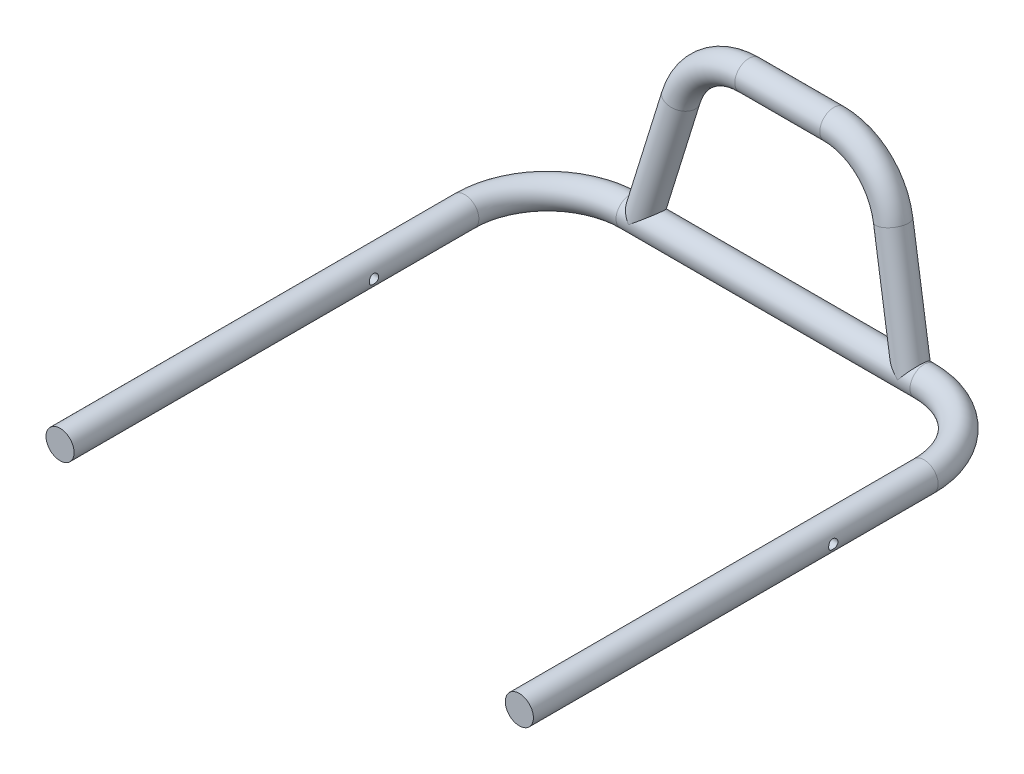
ISO-10303-21;
HEADER;
FILE_DESCRIPTION(('STEP AP214'),'2;1');
FILE_NAME('part.step','',(''),(''),'','','');
FILE_SCHEMA(('AUTOMOTIVE_DESIGN { 1 0 10303 214 1 1 1 1 }'));
ENDSEC;
DATA;
#1=APPLICATION_CONTEXT('core data for automotive mechanical design processes');
#2=APPLICATION_PROTOCOL_DEFINITION('international standard','automotive_design',2000,#1);
#3=PRODUCT_CONTEXT('',#1,'mechanical');
#4=PRODUCT('Part','Part','',(#3));
#5=PRODUCT_RELATED_PRODUCT_CATEGORY('part','',(#4));
#6=PRODUCT_DEFINITION_FORMATION('','',#4);
#7=PRODUCT_DEFINITION_CONTEXT('part definition',#1,'design');
#8=PRODUCT_DEFINITION('design','',#6,#7);
#9=PRODUCT_DEFINITION_SHAPE('','',#8);
#10=(LENGTH_UNIT() NAMED_UNIT(*) SI_UNIT(.MILLI.,.METRE.));
#11=(NAMED_UNIT(*) PLANE_ANGLE_UNIT() SI_UNIT($,.RADIAN.));
#12=(NAMED_UNIT(*) SI_UNIT($,.STERADIAN.) SOLID_ANGLE_UNIT());
#13=UNCERTAINTY_MEASURE_WITH_UNIT(LENGTH_MEASURE(1.E-05),#10,'distance_accuracy_value','');
#14=(GEOMETRIC_REPRESENTATION_CONTEXT(3) GLOBAL_UNCERTAINTY_ASSIGNED_CONTEXT((#13)) GLOBAL_UNIT_ASSIGNED_CONTEXT((#10,
#11,#12)) REPRESENTATION_CONTEXT('',''));
#15=CARTESIAN_POINT('',(0.,0.,0.));
#16=DIRECTION('',(0.,0.,1.));
#17=DIRECTION('',(1.,0.,0.));
#18=AXIS2_PLACEMENT_3D('',#15,#16,#17);
#19=CARTESIAN_POINT('',(155.575,0.,-274.2));
#20=DIRECTION('',(0.,0.,1.));
#21=DIRECTION('',(1.,0.,0.));
#22=AXIS2_PLACEMENT_3D('',#19,#20,#21);
#23=CYLINDRICAL_SURFACE('',#22,9.52500000000001);
#24=CARTESIAN_POINT('',(155.575,0.,0.));
#25=DIRECTION('',(0.,0.,1.));
#26=DIRECTION('',(1.,0.,0.));
#27=AXIS2_PLACEMENT_3D('',#24,#25,#26);
#28=CIRCLE('',#27,9.52500000000001);
#29=CARTESIAN_POINT('',(165.1,0.,0.));
#30=VERTEX_POINT('',#29);
#31=EDGE_CURVE('E121',#30,#30,#28,.F.);
#32=ORIENTED_EDGE('',*,*,#31,.T.);
#33=EDGE_LOOP('',(#32));
#34=FACE_BOUND('',#33,.T.);
#35=CARTESIAN_POINT('',(155.575,0.,-274.200000000001));
#36=DIRECTION('',(0.,0.,1.));
#37=DIRECTION('',(1.,0.,0.));
#38=AXIS2_PLACEMENT_3D('',#35,#36,#37);
#39=CIRCLE('',#38,9.52500000000001);
#40=CARTESIAN_POINT('',(165.1,0.,-274.200000000001));
#41=VERTEX_POINT('',#40);
#42=EDGE_CURVE('E125',#41,#41,#39,.F.);
#43=ORIENTED_EDGE('',*,*,#42,.F.);
#44=EDGE_LOOP('',(#43));
#45=FACE_BOUND('',#44,.T.);
#46=CARTESIAN_POINT('',(165.1,0.,-200.025));
#47=CARTESIAN_POINT('',(165.100000485805,-0.173238677165347,-200.024999194402));
#48=CARTESIAN_POINT('',(165.095230181865,-0.346472492659897,-200.039224844954));
#49=CARTESIAN_POINT('',(165.076670423954,-0.687837590771688,-200.095577420495));
#50=CARTESIAN_POINT('',(165.062880033668,-0.855968341777248,-200.137707242038));
#51=CARTESIAN_POINT('',(165.02777852603,-1.18215660666814,-200.248263597744));
#52=CARTESIAN_POINT('',(165.006479985455,-1.34023044718815,-200.316646173308));
#53=CARTESIAN_POINT('',(164.958536151526,-1.6426654243569,-200.477568223762));
#54=CARTESIAN_POINT('',(164.931889803702,-1.78702384834389,-200.570112463883));
#55=CARTESIAN_POINT('',(164.875022498565,-2.0629298181957,-200.780096930427));
#56=CARTESIAN_POINT('',(164.844715917725,-2.19393674844713,-200.898224168777));
#57=CARTESIAN_POINT('',(164.784414994364,-2.43469379932912,-201.154560716193));
#58=CARTESIAN_POINT('',(164.754420721975,-2.54443923892905,-201.292774435898));
#59=CARTESIAN_POINT('',(164.697198306153,-2.74264419157346,-201.590227740749));
#60=CARTESIAN_POINT('',(164.670074497003,-2.83040092485178,-201.749957623649));
#61=CARTESIAN_POINT('',(164.622965947041,-2.97757492456177,-202.082959099906));
#62=CARTESIAN_POINT('',(164.602979028104,-3.03700083920298,-202.256226541992));
#63=CARTESIAN_POINT('',(164.573308878803,-3.12379824029159,-202.605237478252));
#64=CARTESIAN_POINT('',(164.563301040685,-3.15218269826287,-202.780700636953));
#65=CARTESIAN_POINT('',(164.553762097987,-3.17925806658696,-203.134162419445));
#66=CARTESIAN_POINT('',(164.554227755972,-3.17795815259498,-203.312160242752));
#67=CARTESIAN_POINT('',(164.56529872651,-3.14648819425835,-203.65699880166));
#68=CARTESIAN_POINT('',(164.575439703794,-3.1176401743052,-203.823977679268));
#69=CARTESIAN_POINT('',(164.603958882755,-3.03404956704689,-204.150574107252));
#70=CARTESIAN_POINT('',(164.622338070645,-2.97930387942919,-204.310190773756));
#71=CARTESIAN_POINT('',(164.665593678417,-2.84460650934117,-204.620535479953));
#72=CARTESIAN_POINT('',(164.690569963931,-2.76426310464555,-204.771078980866));
#73=CARTESIAN_POINT('',(164.744163734779,-2.58092291251246,-205.056965133788));
#74=CARTESIAN_POINT('',(164.772782270847,-2.47791958175571,-205.192303378013));
#75=CARTESIAN_POINT('',(164.832262701076,-2.2458341312661,-205.45136582416));
#76=CARTESIAN_POINT('',(164.863163712016,-2.11567125149228,-205.574114805066));
#77=CARTESIAN_POINT('',(164.922420293788,-1.83622813465494,-205.796296771656));
#78=CARTESIAN_POINT('',(164.950775620334,-1.68694606622307,-205.895727521172));
#79=CARTESIAN_POINT('',(165.002118177025,-1.37143367142189,-206.069235753246));
#80=CARTESIAN_POINT('',(165.025049362755,-1.20504990262186,-206.143051935007));
#81=CARTESIAN_POINT('',(165.062553006836,-0.861279339682303,-206.261345077309));
#82=CARTESIAN_POINT('',(165.077128368542,-0.683896391141972,-206.305832229469));
#83=CARTESIAN_POINT('',(165.095797159518,-0.331418658755537,-206.362476739621));
#84=CARTESIAN_POINT('',(165.100317558221,-0.156557979570883,-206.375951894123));
#85=CARTESIAN_POINT('',(165.099647660561,0.192960847123759,-206.373943761325));
#86=CARTESIAN_POINT('',(165.094459003315,0.367619023839895,-206.358465362064));
#87=CARTESIAN_POINT('',(165.075235784768,0.706500575516016,-206.300032192938));
#88=CARTESIAN_POINT('',(165.06146180908,0.870879661700632,-206.257886295793));
#89=CARTESIAN_POINT('',(165.026716136855,1.19016766849015,-206.148325813818));
#90=CARTESIAN_POINT('',(165.005743522482,1.34507537851483,-206.08090800669));
#91=CARTESIAN_POINT('',(164.958043568371,1.64556534104865,-205.920751378905));
#92=CARTESIAN_POINT('',(164.931179368496,1.79079512051445,-205.827393166326));
#93=CARTESIAN_POINT('',(164.874741811841,2.0639558356805,-205.618733573707));
#94=CARTESIAN_POINT('',(164.845167629104,2.19188146775096,-205.503425492099));
#95=CARTESIAN_POINT('',(164.784939923379,2.43285171228499,-205.247942465554));
#96=CARTESIAN_POINT('',(164.754298414526,2.54495607735532,-205.106875704507));
#97=CARTESIAN_POINT('',(164.696774152107,2.74401763337735,-204.8072752722));
#98=CARTESIAN_POINT('',(164.669891429879,2.83097461468097,-204.648741455337));
#99=CARTESIAN_POINT('',(164.623190939376,2.97687025407195,-204.318638176455));
#100=CARTESIAN_POINT('',(164.603358905177,3.03586556962394,-204.147095898639));
#101=CARTESIAN_POINT('',(164.57329392573,3.12386556696095,-203.79569778611));
#102=CARTESIAN_POINT('',(164.563056656301,3.15288375947876,-203.615845734841));
#103=CARTESIAN_POINT('',(164.553832019255,3.17905219686556,-203.26287422007));
#104=CARTESIAN_POINT('',(164.554293708173,3.17776306695417,-203.089883569589));
#105=CARTESIAN_POINT('',(164.565052816908,3.1471942816996,-202.746720887122));
#106=CARTESIAN_POINT('',(164.575349651327,3.117916292281,-202.576548687993));
#107=CARTESIAN_POINT('',(164.60420864668,3.03330550668567,-202.247069269967));
#108=CARTESIAN_POINT('',(164.622610112214,2.97847812359926,-202.087617080611));
#109=CARTESIAN_POINT('',(164.665545662486,2.8447344862872,-201.780052982971));
#110=CARTESIAN_POINT('',(164.690081108238,2.76581288515833,-201.631943600978));
#111=CARTESIAN_POINT('',(164.743854827927,2.58210269895238,-201.344264347995));
#112=CARTESIAN_POINT('',(164.773251594638,2.47633567077753,-201.205349106473));
#113=CARTESIAN_POINT('',(164.832771561993,2.24359115395568,-200.946734842505));
#114=CARTESIAN_POINT('',(164.862894965968,2.11660766813346,-200.82704127219));
#115=CARTESIAN_POINT('',(164.921883469186,1.83909194322319,-200.605566490982));
#116=CARTESIAN_POINT('',(164.95065377219,1.68783480536164,-200.504665195891));
#117=CARTESIAN_POINT('',(165.00240021973,1.36955960976602,-200.329830388399));
#118=CARTESIAN_POINT('',(165.025377845077,1.20254559507019,-200.255889981697));
#119=CARTESIAN_POINT('',(165.062075103426,0.865167329863075,-200.140183816848));
#120=CARTESIAN_POINT('',(165.076162494415,0.695286130622578,-200.097128169614));
#121=CARTESIAN_POINT('',(165.095123424289,0.350267320832523,-200.03954060885));
#122=CARTESIAN_POINT('',(165.099999508888,0.175131176180764,-200.025000814398));
#123=CARTESIAN_POINT('',(165.1,0.,-200.025));
#124=B_SPLINE_CURVE_WITH_KNOTS('',3,(#46,#47,#48,#49,#50,#51,#52,#53,#54,#55,#56,#57,#58,#59,
#60,#61,#62,#63,#64,#65,#66,#67,#68,#69,#70,#71,#72,#73,#74,#75,#76,#77,#78,#79,#80,#81,#82,#83,
#84,#85,#86,#87,#88,#89,#90,#91,#92,#93,#94,#95,#96,#97,#98,#99,#100,#101,#102,#103,#104,#105,
#106,#107,#108,#109,#110,#111,#112,#113,#114,#115,#116,#117,#118,#119,#120,#121,#122,#123),
.UNSPECIFIED.,.T.,.F.,(4,2,2,2,2,2,2,2,2,2,2,2,2,2,2,2,2,2,2,2,2,2,2,2,2,2,2,2,2,2,2,2,2,2,2,2,
2,2,4),(0.,0.519071561632589,1.03819701322438,1.55645698636311,2.07481924951213,
2.60936372597751,3.1440257568791,3.69406121814519,4.24392866899745,4.77526114230344,
5.30642937910265,5.81332424300315,6.32027980466156,6.83539943417539,7.35066800622307,
7.89283745951091,8.43505888444013,8.98265937939886,9.53006948685135,10.0537512658116,
10.5773446429626,11.0857715158083,11.5942632377703,12.1161301950386,12.638156741095,
13.1839024764639,13.7296527614611,14.274292439,14.8186865394104,15.3351123975402,
15.8515075194062,16.3580948898032,16.8647947620873,17.3936046174648,17.92256420318,
18.4721392315144,19.0215736265905,19.5464607283686,20.0712027467109),.UNSPECIFIED.);
#125=CARTESIAN_POINT('',(165.1,0.,-200.025));
#126=VERTEX_POINT('',#125);
#127=EDGE_CURVE('E12',#126,#126,#124,.T.);
#128=ORIENTED_EDGE('',*,*,#127,.F.);
#129=EDGE_LOOP('',(#128));
#130=FACE_BOUND('',#129,.T.);
#131=CARTESIAN_POINT('',(146.05,0.,-200.025));
#132=CARTESIAN_POINT('',(146.049999514195,0.173238677165345,-200.024999194402));
#133=CARTESIAN_POINT('',(146.054769818135,0.346472492659893,-200.039224844954));
#134=CARTESIAN_POINT('',(146.073329576046,0.687837590771684,-200.095577420495));
#135=CARTESIAN_POINT('',(146.087119966332,0.855968341777245,-200.137707242038));
#136=CARTESIAN_POINT('',(146.12222147397,1.18215660666814,-200.248263597744));
#137=CARTESIAN_POINT('',(146.143520014545,1.34023044718816,-200.316646173308));
#138=CARTESIAN_POINT('',(146.191463848474,1.64266542435691,-200.477568223762));
#139=CARTESIAN_POINT('',(146.218110196298,1.78702384834389,-200.570112463883));
#140=CARTESIAN_POINT('',(146.274977501435,2.0629298181957,-200.780096930427));
#141=CARTESIAN_POINT('',(146.305284082275,2.19393674844713,-200.898224168777));
#142=CARTESIAN_POINT('',(146.365585005636,2.43469379932912,-201.154560716193));
#143=CARTESIAN_POINT('',(146.395579278025,2.54443923892905,-201.292774435898));
#144=CARTESIAN_POINT('',(146.452801693847,2.74264419157346,-201.590227740749));
#145=CARTESIAN_POINT('',(146.479925502997,2.83040092485178,-201.749957623649));
#146=CARTESIAN_POINT('',(146.527034052959,2.97757492456177,-202.082959099906));
#147=CARTESIAN_POINT('',(146.547020971896,3.03700083920298,-202.256226541992));
#148=CARTESIAN_POINT('',(146.576691121197,3.12379824029159,-202.605237478252));
#149=CARTESIAN_POINT('',(146.586698959315,3.15218269826287,-202.780700636953));
#150=CARTESIAN_POINT('',(146.596237902013,3.17925806658696,-203.134162419445));
#151=CARTESIAN_POINT('',(146.595772244028,3.17795815259498,-203.312160242752));
#152=CARTESIAN_POINT('',(146.58470127349,3.14648819425835,-203.65699880166));
#153=CARTESIAN_POINT('',(146.574560296206,3.1176401743052,-203.823977679268));
#154=CARTESIAN_POINT('',(146.546041117245,3.03404956704689,-204.150574107252));
#155=CARTESIAN_POINT('',(146.527661929355,2.97930387942919,-204.310190773756));
#156=CARTESIAN_POINT('',(146.484406321583,2.84460650934117,-204.620535479953));
#157=CARTESIAN_POINT('',(146.459430036069,2.76426310464556,-204.771078980866));
#158=CARTESIAN_POINT('',(146.405836265221,2.58092291251246,-205.056965133788));
#159=CARTESIAN_POINT('',(146.377217729153,2.47791958175572,-205.192303378013));
#160=CARTESIAN_POINT('',(146.317737298924,2.2458341312661,-205.45136582416));
#161=CARTESIAN_POINT('',(146.286836287984,2.11567125149229,-205.574114805066));
#162=CARTESIAN_POINT('',(146.227579706212,1.83622813465495,-205.796296771656));
#163=CARTESIAN_POINT('',(146.199224379666,1.68694606622308,-205.895727521172));
#164=CARTESIAN_POINT('',(146.147881822975,1.37143367142189,-206.069235753246));
#165=CARTESIAN_POINT('',(146.124950637245,1.20504990262186,-206.143051935007));
#166=CARTESIAN_POINT('',(146.087446993164,0.861279339682307,-206.261345077309));
#167=CARTESIAN_POINT('',(146.072871631458,0.683896391141974,-206.305832229469));
#168=CARTESIAN_POINT('',(146.054202840482,0.331418658755537,-206.362476739621));
#169=CARTESIAN_POINT('',(146.049682441779,0.156557979570882,-206.375951894123));
#170=CARTESIAN_POINT('',(146.050352339439,-0.192960847123759,-206.373943761325));
#171=CARTESIAN_POINT('',(146.055540996685,-0.367619023839895,-206.358465362064));
#172=CARTESIAN_POINT('',(146.074764215232,-0.706500575516016,-206.300032192938));
#173=CARTESIAN_POINT('',(146.08853819092,-0.870879661700632,-206.257886295793));
#174=CARTESIAN_POINT('',(146.123283863145,-1.19016766849015,-206.148325813818));
#175=CARTESIAN_POINT('',(146.144256477518,-1.34507537851483,-206.08090800669));
#176=CARTESIAN_POINT('',(146.191956431629,-1.64556534104865,-205.920751378905));
#177=CARTESIAN_POINT('',(146.218820631504,-1.79079512051445,-205.827393166326));
#178=CARTESIAN_POINT('',(146.275258188159,-2.0639558356805,-205.618733573707));
#179=CARTESIAN_POINT('',(146.304832370896,-2.19188146775096,-205.503425492099));
#180=CARTESIAN_POINT('',(146.365060076621,-2.43285171228499,-205.247942465554));
#181=CARTESIAN_POINT('',(146.395701585474,-2.54495607735531,-205.106875704507));
#182=CARTESIAN_POINT('',(146.453225847893,-2.74401763337734,-204.8072752722));
#183=CARTESIAN_POINT('',(146.480108570121,-2.83097461468097,-204.648741455337));
#184=CARTESIAN_POINT('',(146.526809060624,-2.97687025407195,-204.318638176455));
#185=CARTESIAN_POINT('',(146.546641094823,-3.03586556962394,-204.147095898639));
#186=CARTESIAN_POINT('',(146.57670607427,-3.12386556696095,-203.79569778611));
#187=CARTESIAN_POINT('',(146.586943343699,-3.15288375947876,-203.615845734841));
#188=CARTESIAN_POINT('',(146.596167980745,-3.17905219686556,-203.26287422007));
#189=CARTESIAN_POINT('',(146.595706291827,-3.17776306695417,-203.089883569589));
#190=CARTESIAN_POINT('',(146.584947183092,-3.1471942816996,-202.746720887122));
#191=CARTESIAN_POINT('',(146.574650348673,-3.11791629228101,-202.576548687993));
#192=CARTESIAN_POINT('',(146.54579135332,-3.03330550668567,-202.247069269967));
#193=CARTESIAN_POINT('',(146.527389887786,-2.97847812359926,-202.087617080611));
#194=CARTESIAN_POINT('',(146.484454337514,-2.8447344862872,-201.780052982971));
#195=CARTESIAN_POINT('',(146.459918891762,-2.76581288515833,-201.631943600978));
#196=CARTESIAN_POINT('',(146.406145172073,-2.58210269895238,-201.344264347995));
#197=CARTESIAN_POINT('',(146.376748405362,-2.47633567077753,-201.205349106473));
#198=CARTESIAN_POINT('',(146.317228438007,-2.24359115395568,-200.946734842505));
#199=CARTESIAN_POINT('',(146.287105034032,-2.11660766813346,-200.82704127219));
#200=CARTESIAN_POINT('',(146.228116530814,-1.8390919432232,-200.605566490982));
#201=CARTESIAN_POINT('',(146.19934622781,-1.68783480536164,-200.504665195891));
#202=CARTESIAN_POINT('',(146.14759978027,-1.36955960976603,-200.329830388399));
#203=CARTESIAN_POINT('',(146.124622154923,-1.20254559507019,-200.255889981697));
#204=CARTESIAN_POINT('',(146.087924896574,-0.865167329863077,-200.140183816848));
#205=CARTESIAN_POINT('',(146.073837505585,-0.695286130622579,-200.097128169614));
#206=CARTESIAN_POINT('',(146.054876575711,-0.350267320832524,-200.03954060885));
#207=CARTESIAN_POINT('',(146.050000491112,-0.175131176180764,-200.025000814398));
#208=CARTESIAN_POINT('',(146.05,0.,-200.025));
#209=B_SPLINE_CURVE_WITH_KNOTS('',3,(#131,#132,#133,#134,#135,#136,#137,#138,#139,#140,#141,
#142,#143,#144,#145,#146,#147,#148,#149,#150,#151,#152,#153,#154,#155,#156,#157,#158,#159,#160,
#161,#162,#163,#164,#165,#166,#167,#168,#169,#170,#171,#172,#173,#174,#175,#176,#177,#178,#179,
#180,#181,#182,#183,#184,#185,#186,#187,#188,#189,#190,#191,#192,#193,#194,#195,#196,#197,#198,
#199,#200,#201,#202,#203,#204,#205,#206,#207,#208),.UNSPECIFIED.,.T.,.F.,(4,2,2,2,2,2,2,2,2,2,2,
2,2,2,2,2,2,2,2,2,2,2,2,2,2,2,2,2,2,2,2,2,2,2,2,2,2,2,4),(0.,0.519071561632584,1.03819701322438,
1.55645698636312,2.07481924951214,2.60936372597751,3.1440257568791,3.69406121814519,
4.24392866899746,4.77526114230344,5.30642937910265,5.81332424300315,6.32027980466156,
6.83539943417539,7.35066800622307,7.8928374595109,8.43505888444013,8.98265937939885,
9.53006948685136,10.0537512658116,10.5773446429626,11.0857715158083,11.5942632377703,
12.1161301950386,12.638156741095,13.1839024764639,13.7296527614612,14.274292439,
14.8186865394104,15.3351123975402,15.8515075194062,16.3580948898033,16.8647947620873,
17.3936046174648,17.92256420318,18.4721392315144,19.0215736265905,19.5464607283686,
20.0712027467109),.UNSPECIFIED.);
#210=CARTESIAN_POINT('',(146.05,0.,-200.025));
#211=VERTEX_POINT('',#210);
#212=EDGE_CURVE('E85',#211,#211,#209,.T.);
#213=ORIENTED_EDGE('',*,*,#212,.F.);
#214=EDGE_LOOP('',(#213));
#215=FACE_BOUND('',#214,.T.);
#216=ADVANCED_FACE('F81',(#34,#45,#130,#215),#23,.T.);
#217=CARTESIAN_POINT('',(71.9014989347422,76.9144291486642,-336.929140612076));
#218=DIRECTION('',(0.241921895599665,-0.966603458097228,0.0845668447084632));
#219=DIRECTION('',(0.970078465084904,0.242791621722242,0.));
#220=AXIS2_PLACEMENT_3D('',#217,#218,#219);
#221=CYLINDRICAL_SURFACE('',#220,9.525);
#222=CARTESIAN_POINT('',(71.9014989347421,76.9144291486646,-336.929140612076));
#223=DIRECTION('',(0.241921895599664,-0.966603458097228,0.0845668447084661));
#224=DIRECTION('',(0.970078465084904,0.242791621722241,0.));
#225=AXIS2_PLACEMENT_3D('',#222,#223,#224);
#226=CIRCLE('',#225,9.525);
#227=CARTESIAN_POINT('',(81.143565727521,79.2099666240209,-337.129974117869));
#228=VERTEX_POINT('',#227);
#229=EDGE_CURVE('E128',#228,#228,#226,.F.);
#230=ORIENTED_EDGE('',*,*,#229,.F.);
#231=EDGE_LOOP('',(#230));
#232=FACE_BOUND('',#231,.T.);
#233=CARTESIAN_POINT('',(91.1516726670395,0.,-330.2));
#234=DIRECTION('',(0.788010753606721,-0.613318697538764,0.053658433163127));
#235=DIRECTION('',(-0.615661475325659,-0.785012134782296,0.0686796625237358));
#236=AXIS2_PLACEMENT_3D('',#233,#234,#235);
#237=ELLIPSE('',#236,12.0873984985663,9.525);
#238=CARTESIAN_POINT('',(91.1516726670395,-0.830158449671454,-339.688754499324));
#239=VERTEX_POINT('',#238);
#240=CARTESIAN_POINT('',(91.1516726670395,0.83015844967146,-320.711245500676));
#241=VERTEX_POINT('',#240);
#242=EDGE_CURVE('E95',#239,#241,#237,.T.);
#243=ORIENTED_EDGE('',*,*,#242,.F.);
#244=CARTESIAN_POINT('',(91.1516726670395,0.,-330.2));
#245=DIRECTION('',(-0.615661475325659,-0.785012134782296,0.0686796625237358));
#246=DIRECTION('',(0.788010753606721,-0.613318697538764,0.053658433163127));
#247=AXIS2_PLACEMENT_3D('',#244,#245,#246);
#248=ELLIPSE('',#247,15.4711645632231,9.525);
#249=EDGE_CURVE('E101',#241,#239,#248,.T.);
#250=ORIENTED_EDGE('',*,*,#249,.F.);
#251=EDGE_LOOP('',(#243,#250));
#252=FACE_BOUND('',#251,.T.);
#253=ADVANCED_FACE('F179',(#232,#252),#221,.T.);
#254=CARTESIAN_POINT('',(-71.9014989347422,76.9144291486642,-336.929140612076));
#255=DIRECTION('',(-0.241921895599665,-0.966603458097228,0.0845668447084632));
#256=DIRECTION('',(0.970078465084904,-0.242791621722242,0.));
#257=AXIS2_PLACEMENT_3D('',#254,#255,#256);
#258=CYLINDRICAL_SURFACE('',#257,9.525);
#259=CARTESIAN_POINT('',(-71.9014989347421,76.9144291486646,-336.929140612076));
#260=DIRECTION('',(0.241921895599664,0.966603458097228,-0.0845668447084661));
#261=DIRECTION('',(-0.970078465084904,0.242791621722241,0.));
#262=AXIS2_PLACEMENT_3D('',#259,#260,#261);
#263=CIRCLE('',#262,9.525);
#264=CARTESIAN_POINT('',(-81.143565727521,79.2099666240209,-337.129974117869));
#265=VERTEX_POINT('',#264);
#266=EDGE_CURVE('E149',#265,#265,#263,.T.);
#267=ORIENTED_EDGE('',*,*,#266,.F.);
#268=EDGE_LOOP('',(#267));
#269=FACE_BOUND('',#268,.T.);
#270=CARTESIAN_POINT('',(-91.1516726670395,0.,-330.2));
#271=DIRECTION('',(-0.788010753606721,-0.613318697538764,0.053658433163127));
#272=DIRECTION('',(0.615661475325659,-0.785012134782296,0.0686796625237358));
#273=AXIS2_PLACEMENT_3D('',#270,#271,#272);
#274=ELLIPSE('',#273,12.0873984985663,9.525);
#275=CARTESIAN_POINT('',(-91.1516726670395,0.83015844967144,-320.711245500676));
#276=VERTEX_POINT('',#275);
#277=CARTESIAN_POINT('',(-91.1516726670395,-0.830158449671475,-339.688754499324));
#278=VERTEX_POINT('',#277);
#279=EDGE_CURVE('E153',#276,#278,#274,.T.);
#280=ORIENTED_EDGE('',*,*,#279,.F.);
#281=CARTESIAN_POINT('',(-91.1516726670395,0.,-330.2));
#282=DIRECTION('',(0.615661475325659,-0.785012134782296,0.0686796625237358));
#283=DIRECTION('',(-0.788010753606721,-0.613318697538764,0.053658433163127));
#284=AXIS2_PLACEMENT_3D('',#281,#282,#283);
#285=ELLIPSE('',#284,15.4711645632231,9.525);
#286=EDGE_CURVE('E108',#278,#276,#285,.T.);
#287=ORIENTED_EDGE('',*,*,#286,.F.);
#288=EDGE_LOOP('',(#280,#287));
#289=FACE_BOUND('',#288,.T.);
#290=ADVANCED_FACE('F83',(#269,#289),#258,.T.);
#291=CARTESIAN_POINT('',(0.,110.482775260513,-339.865990350177));
#292=DIRECTION('',(-1.,0.,0.));
#293=DIRECTION('',(0.,0.,1.));
#294=AXIS2_PLACEMENT_3D('',#291,#292,#293);
#295=CYLINDRICAL_SURFACE('',#294,9.525);
#296=CARTESIAN_POINT('',(-28.7718539017738,110.482775260513,-339.865990350177));
#297=DIRECTION('',(1.,0.,0.));
#298=DIRECTION('',(0.,0.997815912943034,-0.0660560661685154));
#299=AXIS2_PLACEMENT_3D('',#296,#297,#298);
#300=CIRCLE('',#299,9.525);
#301=CARTESIAN_POINT('',(-28.7718539017738,119.971529759837,-340.696148799849));
#302=VERTEX_POINT('',#301);
#303=EDGE_CURVE('E146',#302,#302,#300,.T.);
#304=ORIENTED_EDGE('',*,*,#303,.T.);
#305=EDGE_LOOP('',(#304));
#306=FACE_BOUND('',#305,.T.);
#307=CARTESIAN_POINT('',(28.7718539017738,110.482775260513,-339.865990350177));
#308=DIRECTION('',(1.,0.,0.));
#309=DIRECTION('',(0.,0.997815912943034,-0.0660560661685154));
#310=AXIS2_PLACEMENT_3D('',#307,#308,#309);
#311=CIRCLE('',#310,9.525);
#312=CARTESIAN_POINT('',(28.7718539017738,119.971529759837,-340.696148799849));
#313=VERTEX_POINT('',#312);
#314=EDGE_CURVE('E124',#313,#313,#311,.F.);
#315=ORIENTED_EDGE('',*,*,#314,.T.);
#316=EDGE_LOOP('',(#315));
#317=FACE_BOUND('',#316,.T.);
#318=ADVANCED_FACE('F186',(#306,#317),#295,.T.);
#319=CARTESIAN_POINT('',(-28.7718539017741,66.2019209303351,-335.991917585044));
#320=DIRECTION('',(0.,0.0871557427476583,0.996194698091746));
#321=DIRECTION('',(0.,-0.996194698091746,0.0871557427476583));
#322=AXIS2_PLACEMENT_3D('',#319,#320,#321);
#323=TOROIDAL_SURFACE('',#322,44.45,9.525);
#324=CARTESIAN_POINT('',(-28.7718539017741,66.2019209303351,-335.991917585044));
#325=DIRECTION('',(0.,0.0871557427476583,0.996194698091746));
#326=DIRECTION('',(0.,-0.996194698091746,0.0871557427476583));
#327=AXIS2_PLACEMENT_3D('',#324,#325,#326);
#328=CIRCLE('',#327,53.975);
#329=EDGE_CURVE('',#302,#265,#328,.T.);
#330=ORIENTED_EDGE('',*,*,#303,.F.);
#331=ORIENTED_EDGE('',*,*,#266,.T.);
#332=ORIENTED_EDGE('',*,*,#329,.T.);
#333=ORIENTED_EDGE('',*,*,#329,.F.);
#334=EDGE_LOOP('',(#330,#332,#331,#333));
#335=FACE_BOUND('',#334,.T.);
#336=ADVANCED_FACE('F184',(#335),#323,.T.);
#337=CARTESIAN_POINT('',(0.,0.,-330.2));
#338=DIRECTION('',(-1.,0.,0.));
#339=DIRECTION('',(0.,0.,1.));
#340=AXIS2_PLACEMENT_3D('',#337,#338,#339);
#341=CYLINDRICAL_SURFACE('',#340,9.52500000000001);
#342=CARTESIAN_POINT('',(-99.5749999999996,0.,-330.2));
#343=DIRECTION('',(1.,0.,0.));
#344=DIRECTION('',(0.,0.,-1.));
#345=AXIS2_PLACEMENT_3D('',#342,#343,#344);
#346=CIRCLE('',#345,9.52500000000001);
#347=CARTESIAN_POINT('',(-99.5749999999995,0.,-339.725));
#348=VERTEX_POINT('',#347);
#349=EDGE_CURVE('E138',#348,#348,#346,.T.);
#350=ORIENTED_EDGE('',*,*,#349,.T.);
#351=EDGE_LOOP('',(#350));
#352=FACE_BOUND('',#351,.T.);
#353=ORIENTED_EDGE('',*,*,#286,.T.);
#354=ORIENTED_EDGE('',*,*,#279,.T.);
#355=EDGE_LOOP('',(#353,#354));
#356=FACE_BOUND('',#355,.T.);
#357=CARTESIAN_POINT('',(99.5749999999996,0.,-330.2));
#358=DIRECTION('',(1.,0.,0.));
#359=DIRECTION('',(0.,0.,-1.));
#360=AXIS2_PLACEMENT_3D('',#357,#358,#359);
#361=CIRCLE('',#360,9.52500000000001);
#362=CARTESIAN_POINT('',(99.5749999999995,0.,-339.725));
#363=VERTEX_POINT('',#362);
#364=EDGE_CURVE('E131',#363,#363,#361,.F.);
#365=ORIENTED_EDGE('',*,*,#364,.T.);
#366=EDGE_LOOP('',(#365));
#367=FACE_BOUND('',#366,.T.);
#368=ORIENTED_EDGE('',*,*,#249,.T.);
#369=ORIENTED_EDGE('',*,*,#242,.T.);
#370=EDGE_LOOP('',(#368,#369));
#371=FACE_BOUND('',#370,.T.);
#372=ADVANCED_FACE('F181',(#352,#356,#367,#371),#341,.T.);
#373=CARTESIAN_POINT('',(-155.575,0.,0.));
#374=DIRECTION('',(0.,0.,-1.));
#375=DIRECTION('',(-1.,0.,0.));
#376=AXIS2_PLACEMENT_3D('',#373,#374,#375);
#377=PLANE('',#376);
#378=CARTESIAN_POINT('',(-155.575,0.,0.));
#379=DIRECTION('',(0.,0.,-1.));
#380=DIRECTION('',(-1.,0.,0.));
#381=AXIS2_PLACEMENT_3D('',#378,#379,#380);
#382=CIRCLE('',#381,9.52500000000001);
#383=CARTESIAN_POINT('',(-165.1,0.,0.));
#384=VERTEX_POINT('',#383);
#385=EDGE_CURVE('E144',#384,#384,#382,.T.);
#386=ORIENTED_EDGE('',*,*,#385,.F.);
#387=EDGE_LOOP('',(#386));
#388=FACE_BOUND('',#387,.T.);
#389=ADVANCED_FACE('F178',(#388),#377,.F.);
#390=CARTESIAN_POINT('',(-99.575,0.,-274.2));
#391=DIRECTION('',(0.,1.,0.));
#392=DIRECTION('',(0.,0.,1.));
#393=AXIS2_PLACEMENT_3D('',#390,#391,#392);
#394=TOROIDAL_SURFACE('',#393,56.,9.52500000000001);
#395=CARTESIAN_POINT('',(-155.575,0.,-274.200000000001));
#396=DIRECTION('',(0.,0.,-1.));
#397=DIRECTION('',(-1.,0.,0.));
#398=AXIS2_PLACEMENT_3D('',#395,#396,#397);
#399=CIRCLE('',#398,9.52500000000001);
#400=CARTESIAN_POINT('',(-165.1,0.,-274.200000000001));
#401=VERTEX_POINT('',#400);
#402=EDGE_CURVE('E141',#401,#401,#399,.T.);
#403=CARTESIAN_POINT('',(-99.575,0.,-274.2));
#404=DIRECTION('',(0.,1.,0.));
#405=DIRECTION('',(0.,0.,1.));
#406=AXIS2_PLACEMENT_3D('',#403,#404,#405);
#407=CIRCLE('',#406,65.525);
#408=EDGE_CURVE('',#348,#401,#407,.T.);
#409=ORIENTED_EDGE('',*,*,#349,.F.);
#410=ORIENTED_EDGE('',*,*,#402,.T.);
#411=ORIENTED_EDGE('',*,*,#408,.T.);
#412=ORIENTED_EDGE('',*,*,#408,.F.);
#413=EDGE_LOOP('',(#409,#411,#410,#412));
#414=FACE_BOUND('',#413,.T.);
#415=ADVANCED_FACE('F187',(#414),#394,.T.);
#416=CARTESIAN_POINT('',(-155.575,0.,-274.2));
#417=DIRECTION('',(0.,0.,1.));
#418=DIRECTION('',(1.,0.,0.));
#419=AXIS2_PLACEMENT_3D('',#416,#417,#418);
#420=CYLINDRICAL_SURFACE('',#419,9.52500000000001);
#421=CARTESIAN_POINT('',(-146.05,0.,-206.375));
#422=CARTESIAN_POINT('',(-146.049999514195,-0.173238677165346,-206.375000805598));
#423=CARTESIAN_POINT('',(-146.054769818135,-0.346472492659894,-206.360775155046));
#424=CARTESIAN_POINT('',(-146.073329576046,-0.687837590771685,-206.304422579505));
#425=CARTESIAN_POINT('',(-146.087119966332,-0.855968341777245,-206.262292757962));
#426=CARTESIAN_POINT('',(-146.12222147397,-1.18215660666814,-206.151736402256));
#427=CARTESIAN_POINT('',(-146.143520014545,-1.34023044718816,-206.083353826692));
#428=CARTESIAN_POINT('',(-146.191463848474,-1.6426654243569,-205.922431776238));
#429=CARTESIAN_POINT('',(-146.218110196298,-1.78702384834389,-205.829887536117));
#430=CARTESIAN_POINT('',(-146.274977501435,-2.0629298181957,-205.619903069573));
#431=CARTESIAN_POINT('',(-146.305284082275,-2.19393674844713,-205.501775831223));
#432=CARTESIAN_POINT('',(-146.365585005636,-2.43469379932912,-205.245439283807));
#433=CARTESIAN_POINT('',(-146.395579278025,-2.54443923892904,-205.107225564102));
#434=CARTESIAN_POINT('',(-146.452801693847,-2.74264419157345,-204.809772259251));
#435=CARTESIAN_POINT('',(-146.479925502997,-2.83040092485178,-204.65004237635));
#436=CARTESIAN_POINT('',(-146.527034052959,-2.97757492456177,-204.317040900094));
#437=CARTESIAN_POINT('',(-146.547020971896,-3.03700083920298,-204.143773458008));
#438=CARTESIAN_POINT('',(-146.576691121197,-3.12379824029159,-203.794762521748));
#439=CARTESIAN_POINT('',(-146.586698959315,-3.15218269826286,-203.619299363047));
#440=CARTESIAN_POINT('',(-146.596237902013,-3.17925806658696,-203.265837580555));
#441=CARTESIAN_POINT('',(-146.595772244028,-3.17795815259498,-203.087839757248));
#442=CARTESIAN_POINT('',(-146.58470127349,-3.14648819425836,-202.74300119834));
#443=CARTESIAN_POINT('',(-146.574560296206,-3.11764017430521,-202.576022320732));
#444=CARTESIAN_POINT('',(-146.546041117245,-3.0340495670469,-202.249425892748));
#445=CARTESIAN_POINT('',(-146.527661929355,-2.9793038794292,-202.089809226244));
#446=CARTESIAN_POINT('',(-146.484406321583,-2.84460650934118,-201.779464520047));
#447=CARTESIAN_POINT('',(-146.459430036069,-2.76426310464557,-201.628921019134));
#448=CARTESIAN_POINT('',(-146.405836265221,-2.58092291251247,-201.343034866212));
#449=CARTESIAN_POINT('',(-146.377217729153,-2.47791958175572,-201.207696621986));
#450=CARTESIAN_POINT('',(-146.317737298924,-2.2458341312661,-200.94863417584));
#451=CARTESIAN_POINT('',(-146.286836287984,-2.11567125149229,-200.825885194934));
#452=CARTESIAN_POINT('',(-146.227579706212,-1.83622813465495,-200.603703228344));
#453=CARTESIAN_POINT('',(-146.199224379666,-1.68694606622308,-200.504272478828));
#454=CARTESIAN_POINT('',(-146.147881822975,-1.37143367142189,-200.330764246754));
#455=CARTESIAN_POINT('',(-146.124950637245,-1.20504990262186,-200.256948064993));
#456=CARTESIAN_POINT('',(-146.087446993164,-0.86127933968231,-200.138654922691));
#457=CARTESIAN_POINT('',(-146.072871631458,-0.683896391141977,-200.094167770531));
#458=CARTESIAN_POINT('',(-146.054202840482,-0.331418658755539,-200.037523260379));
#459=CARTESIAN_POINT('',(-146.049682441779,-0.156557979570885,-200.024048105876));
#460=CARTESIAN_POINT('',(-146.050352339439,0.192960847123755,-200.026056238675));
#461=CARTESIAN_POINT('',(-146.055540996685,0.367619023839891,-200.041534637936));
#462=CARTESIAN_POINT('',(-146.074764215232,0.706500575516011,-200.099967807062));
#463=CARTESIAN_POINT('',(-146.08853819092,0.870879661700627,-200.142113704207));
#464=CARTESIAN_POINT('',(-146.123283863145,1.19016766849015,-200.251674186182));
#465=CARTESIAN_POINT('',(-146.144256477518,1.34507537851483,-200.31909199331));
#466=CARTESIAN_POINT('',(-146.191956431629,1.64556534104865,-200.479248621094));
#467=CARTESIAN_POINT('',(-146.218820631504,1.79079512051445,-200.572606833674));
#468=CARTESIAN_POINT('',(-146.275258188159,2.06395583568049,-200.781266426293));
#469=CARTESIAN_POINT('',(-146.304832370896,2.19188146775096,-200.896574507901));
#470=CARTESIAN_POINT('',(-146.365060076621,2.43285171228499,-201.152057534446));
#471=CARTESIAN_POINT('',(-146.395701585474,2.54495607735531,-201.293124295493));
#472=CARTESIAN_POINT('',(-146.453225847893,2.74401763337734,-201.5927247278));
#473=CARTESIAN_POINT('',(-146.480108570121,2.83097461468096,-201.751258544663));
#474=CARTESIAN_POINT('',(-146.526809060624,2.97687025407194,-202.081361823545));
#475=CARTESIAN_POINT('',(-146.546641094823,3.03586556962394,-202.252904101361));
#476=CARTESIAN_POINT('',(-146.57670607427,3.12386556696095,-202.60430221389));
#477=CARTESIAN_POINT('',(-146.586943343699,3.15288375947876,-202.784154265159));
#478=CARTESIAN_POINT('',(-146.596167980745,3.17905219686556,-203.13712577993));
#479=CARTESIAN_POINT('',(-146.595706291827,3.17776306695417,-203.310116430411));
#480=CARTESIAN_POINT('',(-146.584947183092,3.1471942816996,-203.653279112878));
#481=CARTESIAN_POINT('',(-146.574650348673,3.117916292281,-203.823451312007));
#482=CARTESIAN_POINT('',(-146.54579135332,3.03330550668567,-204.152930730033));
#483=CARTESIAN_POINT('',(-146.527389887786,2.97847812359926,-204.312382919389));
#484=CARTESIAN_POINT('',(-146.484454337514,2.8447344862872,-204.619947017029));
#485=CARTESIAN_POINT('',(-146.459918891762,2.76581288515834,-204.768056399022));
#486=CARTESIAN_POINT('',(-146.406145172073,2.5821026989524,-205.055735652005));
#487=CARTESIAN_POINT('',(-146.376748405362,2.47633567077756,-205.194650893527));
#488=CARTESIAN_POINT('',(-146.317228438007,2.2435911539557,-205.453265157495));
#489=CARTESIAN_POINT('',(-146.287105034032,2.11660766813347,-205.57295872781));
#490=CARTESIAN_POINT('',(-146.228116530814,1.8390919432232,-205.794433509018));
#491=CARTESIAN_POINT('',(-146.19934622781,1.68783480536164,-205.895334804109));
#492=CARTESIAN_POINT('',(-146.14759978027,1.36955960976603,-206.070169611601));
#493=CARTESIAN_POINT('',(-146.124622154923,1.20254559507019,-206.144110018302));
#494=CARTESIAN_POINT('',(-146.087924896574,0.865167329863077,-206.259816183152));
#495=CARTESIAN_POINT('',(-146.073837505585,0.695286130622579,-206.302871830386));
#496=CARTESIAN_POINT('',(-146.054876575711,0.350267320832524,-206.36045939115));
#497=CARTESIAN_POINT('',(-146.050000491112,0.175131176180764,-206.374999185601));
#498=CARTESIAN_POINT('',(-146.05,0.,-206.375));
#499=B_SPLINE_CURVE_WITH_KNOTS('',3,(#421,#422,#423,#424,#425,#426,#427,#428,#429,#430,#431,
#432,#433,#434,#435,#436,#437,#438,#439,#440,#441,#442,#443,#444,#445,#446,#447,#448,#449,#450,
#451,#452,#453,#454,#455,#456,#457,#458,#459,#460,#461,#462,#463,#464,#465,#466,#467,#468,#469,
#470,#471,#472,#473,#474,#475,#476,#477,#478,#479,#480,#481,#482,#483,#484,#485,#486,#487,#488,
#489,#490,#491,#492,#493,#494,#495,#496,#497,#498),.UNSPECIFIED.,.T.,.F.,(4,2,2,2,2,2,2,2,2,2,2,
2,2,2,2,2,2,2,2,2,2,2,2,2,2,2,2,2,2,2,2,2,2,2,2,2,2,2,4),(0.,0.519071561632585,1.03819701322438,
1.55645698636312,2.07481924951213,2.60936372597751,3.1440257568791,3.69406121814519,
4.24392866899746,4.77526114230339,5.30642937910265,5.81332424300315,6.32027980466153,
6.83539943417536,7.35066800622307,7.89283745951091,8.43505888444014,8.98265937939885,
9.53006948685136,10.0537512658116,10.5773446429626,11.0857715158083,11.5942632377703,
12.1161301950386,12.638156741095,13.1839024764639,13.7296527614611,14.2742924389999,
14.8186865394104,15.3351123975402,15.8515075194062,16.3580948898033,16.8647947620873,
17.3936046174648,17.92256420318,18.4721392315144,19.0215736265905,19.5464607283686,
20.0712027467109),.UNSPECIFIED.);
#500=CARTESIAN_POINT('',(-146.05,0.,-206.375));
#501=VERTEX_POINT('',#500);
#502=EDGE_CURVE('E137',#501,#501,#499,.T.);
#503=ORIENTED_EDGE('',*,*,#502,.T.);
#504=EDGE_LOOP('',(#503));
#505=FACE_BOUND('',#504,.T.);
#506=CARTESIAN_POINT('',(-165.1,0.,-206.375));
#507=CARTESIAN_POINT('',(-165.100000485805,0.173238677165345,-206.375000805598));
#508=CARTESIAN_POINT('',(-165.095230181865,0.346472492659893,-206.360775155046));
#509=CARTESIAN_POINT('',(-165.076670423954,0.687837590771684,-206.304422579505));
#510=CARTESIAN_POINT('',(-165.062880033668,0.855968341777245,-206.262292757962));
#511=CARTESIAN_POINT('',(-165.02777852603,1.18215660666814,-206.151736402256));
#512=CARTESIAN_POINT('',(-165.006479985455,1.34023044718816,-206.083353826692));
#513=CARTESIAN_POINT('',(-164.958536151526,1.6426654243569,-205.922431776238));
#514=CARTESIAN_POINT('',(-164.931889803702,1.78702384834389,-205.829887536117));
#515=CARTESIAN_POINT('',(-164.875022498565,2.0629298181957,-205.619903069573));
#516=CARTESIAN_POINT('',(-164.844715917725,2.19393674844713,-205.501775831223));
#517=CARTESIAN_POINT('',(-164.784414994364,2.43469379932912,-205.245439283807));
#518=CARTESIAN_POINT('',(-164.754420721975,2.54443923892904,-205.107225564102));
#519=CARTESIAN_POINT('',(-164.697198306153,2.74264419157345,-204.809772259251));
#520=CARTESIAN_POINT('',(-164.670074497003,2.83040092485178,-204.65004237635));
#521=CARTESIAN_POINT('',(-164.622965947041,2.97757492456177,-204.317040900094));
#522=CARTESIAN_POINT('',(-164.602979028104,3.03700083920298,-204.143773458008));
#523=CARTESIAN_POINT('',(-164.573308878803,3.12379824029159,-203.794762521748));
#524=CARTESIAN_POINT('',(-164.563301040685,3.15218269826286,-203.619299363047));
#525=CARTESIAN_POINT('',(-164.553762097987,3.17925806658696,-203.265837580555));
#526=CARTESIAN_POINT('',(-164.554227755972,3.17795815259498,-203.087839757248));
#527=CARTESIAN_POINT('',(-164.56529872651,3.14648819425835,-202.74300119834));
#528=CARTESIAN_POINT('',(-164.575439703794,3.11764017430521,-202.576022320732));
#529=CARTESIAN_POINT('',(-164.603958882755,3.0340495670469,-202.249425892748));
#530=CARTESIAN_POINT('',(-164.622338070645,2.9793038794292,-202.089809226244));
#531=CARTESIAN_POINT('',(-164.665593678417,2.84460650934118,-201.779464520047));
#532=CARTESIAN_POINT('',(-164.690569963931,2.76426310464556,-201.628921019134));
#533=CARTESIAN_POINT('',(-164.744163734779,2.58092291251246,-201.343034866212));
#534=CARTESIAN_POINT('',(-164.772782270847,2.47791958175572,-201.207696621986));
#535=CARTESIAN_POINT('',(-164.832262701076,2.2458341312661,-200.94863417584));
#536=CARTESIAN_POINT('',(-164.863163712016,2.11567125149229,-200.825885194934));
#537=CARTESIAN_POINT('',(-164.922420293788,1.83622813465495,-200.603703228344));
#538=CARTESIAN_POINT('',(-164.950775620334,1.68694606622308,-200.504272478828));
#539=CARTESIAN_POINT('',(-165.002118177025,1.37143367142189,-200.330764246754));
#540=CARTESIAN_POINT('',(-165.025049362755,1.20504990262186,-200.256948064993));
#541=CARTESIAN_POINT('',(-165.062553006836,0.86127933968231,-200.138654922691));
#542=CARTESIAN_POINT('',(-165.077128368542,0.683896391141976,-200.094167770531));
#543=CARTESIAN_POINT('',(-165.095797159518,0.331418658755538,-200.037523260379));
#544=CARTESIAN_POINT('',(-165.100317558221,0.156557979570884,-200.024048105876));
#545=CARTESIAN_POINT('',(-165.099647660561,-0.192960847123756,-200.026056238675));
#546=CARTESIAN_POINT('',(-165.094459003315,-0.367619023839892,-200.041534637936));
#547=CARTESIAN_POINT('',(-165.075235784768,-0.706500575516016,-200.099967807062));
#548=CARTESIAN_POINT('',(-165.06146180908,-0.870879661700636,-200.142113704207));
#549=CARTESIAN_POINT('',(-165.026716136855,-1.19016766849015,-200.251674186182));
#550=CARTESIAN_POINT('',(-165.005743522482,-1.34507537851483,-200.31909199331));
#551=CARTESIAN_POINT('',(-164.958043568371,-1.64556534104864,-200.479248621094));
#552=CARTESIAN_POINT('',(-164.931179368496,-1.79079512051444,-200.572606833674));
#553=CARTESIAN_POINT('',(-164.874741811841,-2.06395583568049,-200.781266426293));
#554=CARTESIAN_POINT('',(-164.845167629104,-2.19188146775095,-200.896574507901));
#555=CARTESIAN_POINT('',(-164.784939923379,-2.43285171228499,-201.152057534446));
#556=CARTESIAN_POINT('',(-164.754298414526,-2.54495607735532,-201.293124295493));
#557=CARTESIAN_POINT('',(-164.696774152107,-2.74401763337735,-201.5927247278));
#558=CARTESIAN_POINT('',(-164.669891429879,-2.83097461468097,-201.751258544663));
#559=CARTESIAN_POINT('',(-164.623190939376,-2.97687025407195,-202.081361823545));
#560=CARTESIAN_POINT('',(-164.603358905177,-3.03586556962394,-202.252904101361));
#561=CARTESIAN_POINT('',(-164.57329392573,-3.12386556696095,-202.60430221389));
#562=CARTESIAN_POINT('',(-164.563056656301,-3.15288375947876,-202.784154265159));
#563=CARTESIAN_POINT('',(-164.553832019255,-3.17905219686556,-203.13712577993));
#564=CARTESIAN_POINT('',(-164.554293708173,-3.17776306695417,-203.310116430411));
#565=CARTESIAN_POINT('',(-164.565052816908,-3.1471942816996,-203.653279112878));
#566=CARTESIAN_POINT('',(-164.575349651327,-3.117916292281,-203.823451312007));
#567=CARTESIAN_POINT('',(-164.60420864668,-3.03330550668567,-204.152930730033));
#568=CARTESIAN_POINT('',(-164.622610112214,-2.97847812359926,-204.312382919389));
#569=CARTESIAN_POINT('',(-164.665545662486,-2.8447344862872,-204.619947017029));
#570=CARTESIAN_POINT('',(-164.690081108238,-2.76581288515834,-204.768056399022));
#571=CARTESIAN_POINT('',(-164.743854827927,-2.5821026989524,-205.055735652005));
#572=CARTESIAN_POINT('',(-164.773251594638,-2.47633567077755,-205.194650893527));
#573=CARTESIAN_POINT('',(-164.832771561993,-2.24359115395569,-205.453265157495));
#574=CARTESIAN_POINT('',(-164.862894965968,-2.11660766813347,-205.57295872781));
#575=CARTESIAN_POINT('',(-164.921883469186,-1.8390919432232,-205.794433509018));
#576=CARTESIAN_POINT('',(-164.95065377219,-1.68783480536165,-205.895334804109));
#577=CARTESIAN_POINT('',(-165.00240021973,-1.36955960976604,-206.070169611601));
#578=CARTESIAN_POINT('',(-165.025377845077,-1.2025455950702,-206.144110018302));
#579=CARTESIAN_POINT('',(-165.062075103426,-0.865167329863079,-206.259816183152));
#580=CARTESIAN_POINT('',(-165.076162494415,-0.695286130622581,-206.302871830386));
#581=CARTESIAN_POINT('',(-165.095123424289,-0.350267320832525,-206.36045939115));
#582=CARTESIAN_POINT('',(-165.099999508888,-0.175131176180765,-206.374999185601));
#583=CARTESIAN_POINT('',(-165.1,0.,-206.375));
#584=B_SPLINE_CURVE_WITH_KNOTS('',3,(#506,#507,#508,#509,#510,#511,#512,#513,#514,#515,#516,
#517,#518,#519,#520,#521,#522,#523,#524,#525,#526,#527,#528,#529,#530,#531,#532,#533,#534,#535,
#536,#537,#538,#539,#540,#541,#542,#543,#544,#545,#546,#547,#548,#549,#550,#551,#552,#553,#554,
#555,#556,#557,#558,#559,#560,#561,#562,#563,#564,#565,#566,#567,#568,#569,#570,#571,#572,#573,
#574,#575,#576,#577,#578,#579,#580,#581,#582,#583),.UNSPECIFIED.,.T.,.F.,(4,2,2,2,2,2,2,2,2,2,2,
2,2,2,2,2,2,2,2,2,2,2,2,2,2,2,2,2,2,2,2,2,2,2,2,2,2,2,4),(0.,0.519071561632584,1.03819701322438,
1.55645698636311,2.07481924951213,2.60936372597751,3.1440257568791,3.69406121814519,
4.24392866899746,4.77526114230339,5.30642937910265,5.81332424300312,6.32027980466153,
6.83539943417539,7.35066800622307,7.8928374595109,8.43505888444013,8.98265937939885,
9.53006948685136,10.0537512658116,10.5773446429626,11.0857715158083,11.5942632377703,
12.1161301950386,12.638156741095,13.1839024764639,13.7296527614612,14.274292439,
14.8186865394104,15.3351123975402,15.8515075194062,16.3580948898032,16.8647947620873,
17.3936046174648,17.92256420318,18.4721392315144,19.0215736265905,19.5464607283686,
20.0712027467109),.UNSPECIFIED.);
#585=CARTESIAN_POINT('',(-165.1,0.,-206.375));
#586=VERTEX_POINT('',#585);
#587=EDGE_CURVE('E155',#586,#586,#584,.T.);
#588=ORIENTED_EDGE('',*,*,#587,.T.);
#589=EDGE_LOOP('',(#588));
#590=FACE_BOUND('',#589,.T.);
#591=ORIENTED_EDGE('',*,*,#385,.T.);
#592=EDGE_LOOP('',(#591));
#593=FACE_BOUND('',#592,.T.);
#594=ORIENTED_EDGE('',*,*,#402,.F.);
#595=EDGE_LOOP('',(#594));
#596=FACE_BOUND('',#595,.T.);
#597=ADVANCED_FACE('F167',(#505,#590,#593,#596),#420,.T.);
#598=CARTESIAN_POINT('',(-165.1,0.,-203.2));
#599=DIRECTION('',(1.,0.,0.));
#600=DIRECTION('',(0.,0.,-1.));
#601=AXIS2_PLACEMENT_3D('',#598,#599,#600);
#602=CYLINDRICAL_SURFACE('',#601,3.175);
#603=ORIENTED_EDGE('',*,*,#502,.F.);
#604=EDGE_LOOP('',(#603));
#605=FACE_BOUND('',#604,.T.);
#606=ORIENTED_EDGE('',*,*,#587,.F.);
#607=EDGE_LOOP('',(#606));
#608=FACE_BOUND('',#607,.T.);
#609=ADVANCED_FACE('F171',(#605,#608),#602,.F.);
#610=CARTESIAN_POINT('',(28.7718539017741,66.2019209303351,-335.991917585044));
#611=DIRECTION('',(0.,-0.0871557427476583,-0.996194698091746));
#612=DIRECTION('',(0.,0.996194698091746,-0.0871557427476583));
#613=AXIS2_PLACEMENT_3D('',#610,#611,#612);
#614=TOROIDAL_SURFACE('',#613,44.45,9.525);
#615=CARTESIAN_POINT('',(28.7718539017741,66.2019209303351,-335.991917585044));
#616=DIRECTION('',(0.,-0.0871557427476583,-0.996194698091746));
#617=DIRECTION('',(0.,0.996194698091746,-0.0871557427476583));
#618=AXIS2_PLACEMENT_3D('',#615,#616,#617);
#619=CIRCLE('',#618,53.975);
#620=EDGE_CURVE('',#313,#228,#619,.T.);
#621=ORIENTED_EDGE('',*,*,#314,.F.);
#622=ORIENTED_EDGE('',*,*,#229,.T.);
#623=ORIENTED_EDGE('',*,*,#620,.T.);
#624=ORIENTED_EDGE('',*,*,#620,.F.);
#625=EDGE_LOOP('',(#621,#623,#622,#624));
#626=FACE_BOUND('',#625,.T.);
#627=ADVANCED_FACE('F176',(#626),#614,.T.);
#628=CARTESIAN_POINT('',(155.575,0.,0.));
#629=DIRECTION('',(0.,0.,-1.));
#630=DIRECTION('',(1.,0.,0.));
#631=AXIS2_PLACEMENT_3D('',#628,#629,#630);
#632=PLANE('',#631);
#633=ORIENTED_EDGE('',*,*,#31,.F.);
#634=EDGE_LOOP('',(#633));
#635=FACE_BOUND('',#634,.T.);
#636=ADVANCED_FACE('F206',(#635),#632,.F.);
#637=CARTESIAN_POINT('',(99.575,0.,-274.2));
#638=DIRECTION('',(0.,-1.,0.));
#639=DIRECTION('',(0.,0.,-1.));
#640=AXIS2_PLACEMENT_3D('',#637,#638,#639);
#641=TOROIDAL_SURFACE('',#640,56.,9.52500000000001);
#642=CARTESIAN_POINT('',(99.575,0.,-274.2));
#643=DIRECTION('',(0.,-1.,0.));
#644=DIRECTION('',(0.,0.,-1.));
#645=AXIS2_PLACEMENT_3D('',#642,#643,#644);
#646=CIRCLE('',#645,65.525);
#647=EDGE_CURVE('',#363,#41,#646,.T.);
#648=ORIENTED_EDGE('',*,*,#364,.F.);
#649=ORIENTED_EDGE('',*,*,#42,.T.);
#650=ORIENTED_EDGE('',*,*,#647,.T.);
#651=ORIENTED_EDGE('',*,*,#647,.F.);
#652=EDGE_LOOP('',(#648,#650,#649,#651));
#653=FACE_BOUND('',#652,.T.);
#654=ADVANCED_FACE('F205',(#653),#641,.T.);
#655=CARTESIAN_POINT('',(165.1,0.,-203.2));
#656=DIRECTION('',(-1.,0.,0.));
#657=DIRECTION('',(0.,0.,1.));
#658=AXIS2_PLACEMENT_3D('',#655,#656,#657);
#659=CYLINDRICAL_SURFACE('',#658,3.175);
#660=ORIENTED_EDGE('',*,*,#212,.T.);
#661=EDGE_LOOP('',(#660));
#662=FACE_BOUND('',#661,.T.);
#663=ORIENTED_EDGE('',*,*,#127,.T.);
#664=EDGE_LOOP('',(#663));
#665=FACE_BOUND('',#664,.T.);
#666=ADVANCED_FACE('F212',(#662,#665),#659,.F.);
#667=CLOSED_SHELL('',(#216,#253,#290,#318,#336,#372,#389,#415,#597,#609,#627,#636,#654,#666));
#668=MANIFOLD_SOLID_BREP('B2',#667);
#669=ADVANCED_BREP_SHAPE_REPRESENTATION('',(#18,#668),#14);
#670=SHAPE_DEFINITION_REPRESENTATION(#9,#669);
ENDSEC;
END-ISO-10303-21;
